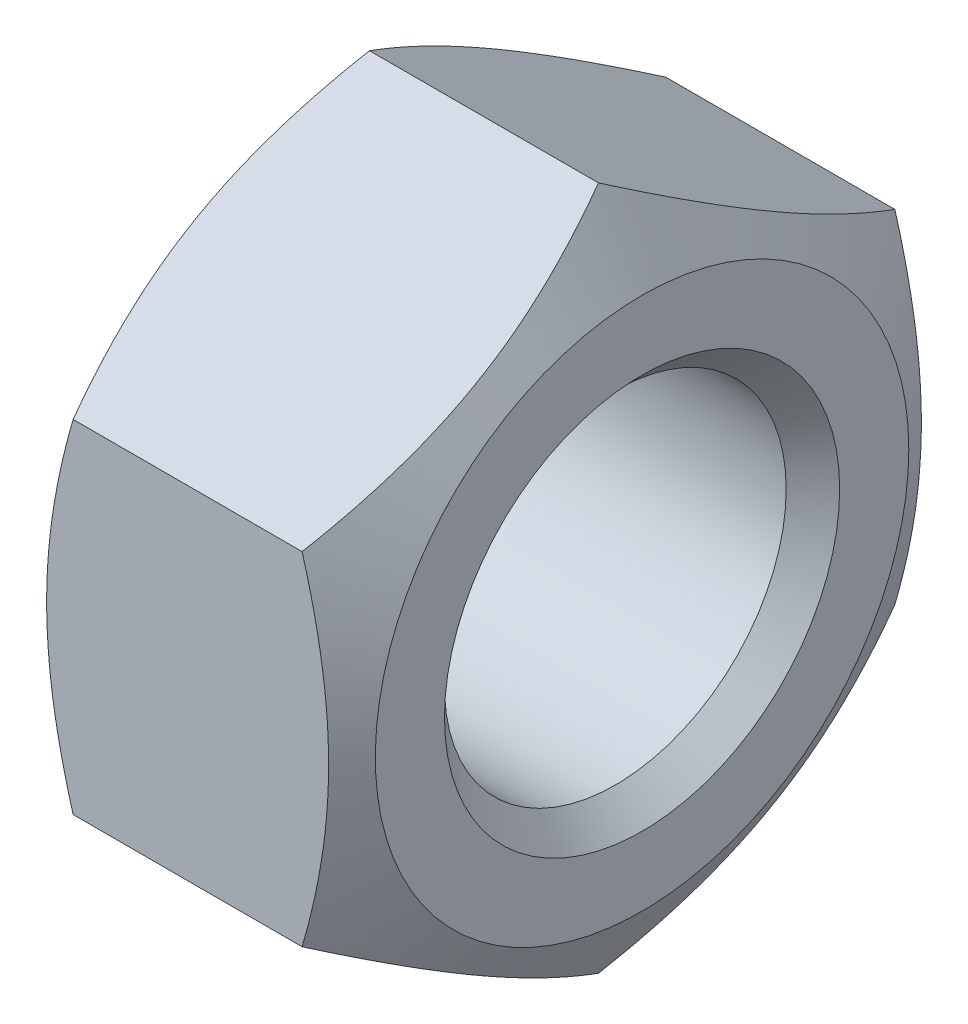
ISO-10303-21;
HEADER;
FILE_DESCRIPTION(('STEP AP214'),'2;1');
FILE_NAME('part.step','',(''),(''),'','','');
FILE_SCHEMA(('AUTOMOTIVE_DESIGN { 1 0 10303 214 1 1 1 1 }'));
ENDSEC;
DATA;
#1=APPLICATION_CONTEXT('core data for automotive mechanical design processes');
#2=APPLICATION_PROTOCOL_DEFINITION('international standard','automotive_design',2000,#1);
#3=PRODUCT_CONTEXT('',#1,'mechanical');
#4=PRODUCT('Part','Part','',(#3));
#5=PRODUCT_RELATED_PRODUCT_CATEGORY('part','',(#4));
#6=PRODUCT_DEFINITION_FORMATION('','',#4);
#7=PRODUCT_DEFINITION_CONTEXT('part definition',#1,'design');
#8=PRODUCT_DEFINITION('design','',#6,#7);
#9=PRODUCT_DEFINITION_SHAPE('','',#8);
#10=(LENGTH_UNIT() NAMED_UNIT(*) SI_UNIT(.MILLI.,.METRE.));
#11=(NAMED_UNIT(*) PLANE_ANGLE_UNIT() SI_UNIT($,.RADIAN.));
#12=(NAMED_UNIT(*) SI_UNIT($,.STERADIAN.) SOLID_ANGLE_UNIT());
#13=UNCERTAINTY_MEASURE_WITH_UNIT(LENGTH_MEASURE(1.E-05),#10,'distance_accuracy_value','');
#14=(GEOMETRIC_REPRESENTATION_CONTEXT(3) GLOBAL_UNCERTAINTY_ASSIGNED_CONTEXT((#13)) GLOBAL_UNIT_ASSIGNED_CONTEXT((#10,
#11,#12)) REPRESENTATION_CONTEXT('',''));
#15=CARTESIAN_POINT('',(0.,0.,0.));
#16=DIRECTION('',(0.,0.,1.));
#17=DIRECTION('',(1.,0.,0.));
#18=AXIS2_PLACEMENT_3D('',#15,#16,#17);
#19=CARTESIAN_POINT('',(17.,-8.66025403784439,15.));
#20=DIRECTION('',(0.,0.866025403784439,-0.5));
#21=DIRECTION('',(-1.,0.,0.));
#22=AXIS2_PLACEMENT_3D('',#19,#20,#21);
#23=PLANE('',#22);
#24=DIRECTION('',(-1.,0.,0.));
#25=VECTOR('',#24,1.);
#26=CARTESIAN_POINT('',(17.,-17.3205080756888,0.));
#27=LINE('',#26,#25);
#28=CARTESIAN_POINT('',(13.79422863406,-17.3205080756888,0.));
#29=VERTEX_POINT('',#28);
#30=CARTESIAN_POINT('',(2.20577136594005,-17.3205080756888,0.));
#31=VERTEX_POINT('',#30);
#32=EDGE_CURVE('E11',#29,#31,#27,.T.);
#33=ORIENTED_EDGE('',*,*,#32,.F.);
#34=CARTESIAN_POINT('',(13.79422863406,-8.6602540378443,14.9999999999999));
#35=CARTESIAN_POINT('',(13.8991261757555,-8.84192359171488,14.6852983750339));
#36=CARTESIAN_POINT('',(13.9995147695393,-9.02420189279882,14.3694011550503));
#37=CARTESIAN_POINT('',(14.1875500503491,-9.38543593226138,13.7433607897277));
#38=CARTESIAN_POINT('',(14.2754561123092,-9.56435807768128,13.4332759667625));
#39=CARTESIAN_POINT('',(14.4385675555884,-9.91987517944504,12.8173894351363));
#40=CARTESIAN_POINT('',(14.5139975727656,-10.0964419783983,12.5116313682666));
#41=CARTESIAN_POINT('',(14.6521419276136,-10.4482799338435,11.9027046336144));
#42=CARTESIAN_POINT('',(14.7150264816919,-10.6235321317174,11.5995637269091));
#43=CARTESIAN_POINT('',(14.8313310937253,-10.9825174262573,10.9776579352064));
#44=CARTESIAN_POINT('',(14.8841975243033,-11.1662770925188,10.6588041275683));
#45=CARTESIAN_POINT('',(14.9746410853243,-11.5312900009397,10.0254562474897));
#46=CARTESIAN_POINT('',(15.0124831807219,-11.7125266536877,9.7109907629071));
#47=CARTESIAN_POINT('',(15.0729487529458,-12.0746196584904,9.08367247843385));
#48=CARTESIAN_POINT('',(15.0956890987236,-12.255467872304,8.77082633692085));
#49=CARTESIAN_POINT('',(15.1261235080341,-12.6183494212901,8.14349468128454));
#50=CARTESIAN_POINT('',(15.1337597892935,-12.8003846449568,7.82900746863451));
#51=CARTESIAN_POINT('',(15.1341799744232,-13.1647935307548,7.19798510778311));
#52=CARTESIAN_POINT('',(15.1268846143356,-13.3471638377922,6.88144796819391));
#53=CARTESIAN_POINT('',(15.0970018982318,-13.7109788717826,6.25026432791454));
#54=CARTESIAN_POINT('',(15.0744763792369,-13.8924243637041,5.93561535275951));
#55=CARTESIAN_POINT('',(15.01429867302,-14.2564875643899,5.30517636923064));
#56=CARTESIAN_POINT('',(14.976530393413,-14.4391034360136,4.98939647053381));
#57=CARTESIAN_POINT('',(14.8861094398957,-14.806857702537,4.35338761379408));
#58=CARTESIAN_POINT('',(14.8331897336047,-14.9919787978695,4.03318692905613));
#59=CARTESIAN_POINT('',(14.716803975678,-15.3522318054601,3.40910116234804));
#60=CARTESIAN_POINT('',(14.6539350189117,-15.5274315108066,3.10514309441268));
#61=CARTESIAN_POINT('',(14.5157143364314,-15.8795664735211,2.49467465582763));
#62=CARTESIAN_POINT('',(14.4401870490862,-16.0564875144641,2.18819593768071));
#63=CARTESIAN_POINT('',(14.2767842003472,-16.4130129248835,1.57086584655567));
#64=CARTESIAN_POINT('',(14.1886781775843,-16.5925932658414,1.26006202100373));
#65=CARTESIAN_POINT('',(14.0001437538872,-16.9552249828855,0.632425493753301));
#66=CARTESIAN_POINT('',(13.8994499743215,-17.1382416695031,0.315652258817438));
#67=CARTESIAN_POINT('',(13.79422863406,-17.3205080756887,0.));
#68=B_SPLINE_CURVE_WITH_KNOTS('',3,(#34,#35,#36,#37,#38,#39,#40,#41,#42,#43,#44,#45,#46,#47,#48,
#49,#50,#51,#52,#53,#54,#55,#56,#57,#58,#59,#60,#61,#62,#63,#64,#65,#66,#67),.UNSPECIFIED.,.F.,
.F.,(4,2,2,2,2,2,2,2,2,2,2,2,2,2,2,2,4),(0.,1.13466083755171,2.24042740435503,3.3233779408359,
4.39045081066898,5.50556903767364,6.60004031109338,7.68593983715371,8.77598561862349,
9.87183286592656,10.9632572959162,12.0631560448031,13.1837781997268,14.2528528343399,
15.3382126822682,16.4468941683269,17.5850584029954),.UNSPECIFIED.);
#69=CARTESIAN_POINT('',(13.7942286340599,-8.66025403784439,15.));
#70=VERTEX_POINT('',#69);
#71=EDGE_CURVE('E378',#70,#29,#68,.T.);
#72=ORIENTED_EDGE('',*,*,#71,.F.);
#73=DIRECTION('',(-1.,0.,0.));
#74=VECTOR('',#73,1.);
#75=CARTESIAN_POINT('',(17.,-8.66025403784439,15.));
#76=LINE('',#75,#74);
#77=CARTESIAN_POINT('',(2.20577136594005,-8.66025403784439,15.));
#78=VERTEX_POINT('',#77);
#79=EDGE_CURVE('E126',#70,#78,#76,.T.);
#80=ORIENTED_EDGE('',*,*,#79,.T.);
#81=CARTESIAN_POINT('',(2.20577136594,-17.3205080756887,0.));
#82=CARTESIAN_POINT('',(2.10087382424535,-17.1388032507926,0.314681261226636));
#83=CARTESIAN_POINT('',(2.00048523046242,-16.9563673838456,0.630487510513418));
#84=CARTESIAN_POINT('',(1.81244994965383,-16.5948175434154,1.25634554805803));
#85=CARTESIAN_POINT('',(1.72454388769406,-16.4157372821103,1.56633908277329));
#86=CARTESIAN_POINT('',(1.56143244441489,-16.0601224507556,2.18216919019412));
#87=CARTESIAN_POINT('',(1.48600242723746,-15.8836115969107,2.48795955698836));
#88=CARTESIAN_POINT('',(1.34785807238815,-15.5321845533786,3.09712353174847));
#89=CARTESIAN_POINT('',(1.28497351830886,-15.3572829261803,3.4004668405309));
#90=CARTESIAN_POINT('',(1.16866890627653,-14.9981893590792,4.02231012102965));
#91=CARTESIAN_POINT('',(1.11580247570014,-14.8139336947084,4.34087756401095));
#92=CARTESIAN_POINT('',(1.02535891468117,-14.4479447953476,4.97366195543826));
#93=CARTESIAN_POINT('',(0.987516819284308,-14.2662280234631,5.28785024310353));
#94=CARTESIAN_POINT('',(0.927051247060506,-13.9040009552543,5.91509112603361));
#95=CARTESIAN_POINT('',(0.90431090128249,-13.7234923561336,6.22813334418601));
#96=CARTESIAN_POINT('',(0.873876491969445,-13.3616479802379,6.85606381200467));
#97=CARTESIAN_POINT('',(0.866240210708108,-13.1803116767426,7.1709545464181));
#98=CARTESIAN_POINT('',(0.86582002557521,-12.816034724781,7.80205307931123));
#99=CARTESIAN_POINT('',(0.873115385660845,-12.6330906741754,8.11825896788828));
#100=CARTESIAN_POINT('',(0.902998101762099,-12.2683771242384,8.7489238497323));
#101=CARTESIAN_POINT('',(0.925523620756717,-12.0866058644418,9.06338474271374));
#102=CARTESIAN_POINT('',(0.985701326973686,-11.7226612895143,9.69389221485569));
#103=CARTESIAN_POINT('',(1.02346960658137,-11.5404958110501,10.0099321481672));
#104=CARTESIAN_POINT('',(1.11389056010084,-11.1735731173405,10.6464211137066));
#105=CARTESIAN_POINT('',(1.1668102663936,-10.9888317377119,10.9668410274175));
#106=CARTESIAN_POINT('',(1.28319602432284,-10.6284841133942,11.5908721671441));
#107=CARTESIAN_POINT('',(1.34606498108973,-10.4528485575494,11.8945785966794));
#108=CARTESIAN_POINT('',(1.48428566357089,-10.1002348628822,12.504770639246));
#109=CARTESIAN_POINT('',(1.55981295091627,-9.92327702771871,12.8112281142407));
#110=CARTESIAN_POINT('',(1.72321579965525,-9.56691619149318,13.428653222321));
#111=CARTESIAN_POINT('',(1.81132182241793,-9.3875423534508,13.739576272386));
#112=CARTESIAN_POINT('',(1.99985624611413,-9.02530903503196,14.3674428151867));
#113=CARTESIAN_POINT('',(2.10055002567909,-8.84248370964822,14.6843265325799));
#114=CARTESIAN_POINT('',(2.20577136594001,-8.66025403784432,15.));
#115=B_SPLINE_CURVE_WITH_KNOTS('',3,(#81,#82,#83,#84,#85,#86,#87,#88,#89,#90,#91,#92,#93,#94,
#95,#96,#97,#98,#99,#100,#101,#102,#103,#104,#105,#106,#107,#108,#109,#110,#111,#112,#113,#114),
.UNSPECIFIED.,.F.,.F.,(4,2,2,2,2,2,2,2,2,2,2,2,2,2,2,2,4),(0.,1.13466083754263,2.24042740434324,
3.3233779408273,4.39045081066893,5.50556903763476,6.60004031104235,7.68593983711598,
8.77598561862312,9.87183286590376,10.963257295885,12.0631560447792,13.1837781997269,
14.2528528343465,15.3382126822773,16.4468941683339,17.5850584029954),.UNSPECIFIED.);
#116=EDGE_CURVE('E229',#31,#78,#115,.T.);
#117=ORIENTED_EDGE('',*,*,#116,.F.);
#118=EDGE_LOOP('',(#33,#72,#80,#117));
#119=FACE_BOUND('',#118,.T.);
#120=ADVANCED_FACE('F17',(#119),#23,.F.);
#121=CARTESIAN_POINT('',(17.,-17.3205080756888,0.));
#122=DIRECTION('',(0.,0.866025403784439,0.5));
#123=DIRECTION('',(1.,0.,0.));
#124=AXIS2_PLACEMENT_3D('',#121,#122,#123);
#125=PLANE('',#124);
#126=DIRECTION('',(-1.,0.,0.));
#127=VECTOR('',#126,1.);
#128=CARTESIAN_POINT('',(17.,-8.66025403784439,-15.));
#129=LINE('',#128,#127);
#130=CARTESIAN_POINT('',(13.7942286340599,-8.66025403784439,-15.));
#131=VERTEX_POINT('',#130);
#132=CARTESIAN_POINT('',(2.20577136594005,-8.66025403784439,-15.));
#133=VERTEX_POINT('',#132);
#134=EDGE_CURVE('E31',#131,#133,#129,.T.);
#135=ORIENTED_EDGE('',*,*,#134,.F.);
#136=CARTESIAN_POINT('',(13.79422863406,-17.3205080756887,0.));
#137=CARTESIAN_POINT('',(13.8991261757522,-17.1388032507969,-0.314681261219434));
#138=CARTESIAN_POINT('',(13.9995147695326,-16.9563673838546,-0.630487510499391));
#139=CARTESIAN_POINT('',(14.1875500503379,-16.5948175434315,-1.25634554803557));
#140=CARTESIAN_POINT('',(14.2754561122967,-16.4157372821286,-1.56633908274925));
#141=CARTESIAN_POINT('',(14.4385675555758,-16.060122450775,-2.1821691901713));
#142=CARTESIAN_POINT('',(14.5139975727539,-15.8836115969291,-2.48795955696838));
#143=CARTESIAN_POINT('',(14.6521419276067,-15.5321845533901,-3.097123531737));
#144=CARTESIAN_POINT('',(14.7150264816887,-15.3572829261861,-3.40046684052516));
#145=CARTESIAN_POINT('',(14.8313310937235,-14.998189359081,-4.02231012102193));
#146=CARTESIAN_POINT('',(14.8841975243002,-14.8139336947121,-4.34087756399548));
#147=CARTESIAN_POINT('',(14.9746410853196,-14.4479447953549,-4.9736619554131));
#148=CARTESIAN_POINT('',(15.0124831807163,-14.2662280234721,-5.28785024307643));
#149=CARTESIAN_POINT('',(15.07294875294,-13.9040009552646,-5.91509112600732));
#150=CARTESIAN_POINT('',(15.0956890987179,-13.7234923561436,-6.22813334416247));
#151=CARTESIAN_POINT('',(15.1261235080309,-13.3616479802445,-6.85606381199092));
#152=CARTESIAN_POINT('',(15.133759789292,-13.1803116767462,-7.17095454641139));
#153=CARTESIAN_POINT('',(15.1341799744246,-12.8160347247786,-7.8020530793159));
#154=CARTESIAN_POINT('',(15.126884614339,-12.63309067417,-8.11825896789729));
#155=CARTESIAN_POINT('',(15.0970018982376,-12.2683771242286,-8.74892384974684));
#156=CARTESIAN_POINT('',(15.074476379243,-12.0866058644306,-9.06338474272947));
#157=CARTESIAN_POINT('',(15.0142986730261,-11.7226612895021,-9.69389221487091));
#158=CARTESIAN_POINT('',(14.9765303934186,-11.5404958110385,-10.0099321481807));
#159=CARTESIAN_POINT('',(14.8861094398991,-11.1735731173331,-10.6464211137145));
#160=CARTESIAN_POINT('',(14.8331897336063,-10.9888317377081,-10.9668410274214));
#161=CARTESIAN_POINT('',(14.7168039756758,-10.628484113393,-11.5908721671486));
#162=CARTESIAN_POINT('',(14.6539350189073,-10.4528485575471,-11.8945785966884));
#163=CARTESIAN_POINT('',(14.5157143364241,-10.1002348628776,-12.5047706392608));
#164=CARTESIAN_POINT('',(14.4401870490784,-9.923277027713,-12.8112281142568));
#165=CARTESIAN_POINT('',(14.2767842003395,-9.56691619148652,-13.428653222337));
#166=CARTESIAN_POINT('',(14.1886781775773,-9.38754235344429,-13.7395762724004));
#167=CARTESIAN_POINT('',(14.000143753883,-9.02530903502761,-14.3674428151952));
#168=CARTESIAN_POINT('',(13.8994499743195,-8.84248370964587,-14.6843265325841));
#169=CARTESIAN_POINT('',(13.79422863406,-8.66025403784432,-15.));
#170=B_SPLINE_CURVE_WITH_KNOTS('',3,(#136,#137,#138,#139,#140,#141,#142,#143,#144,#145,#146,
#147,#148,#149,#150,#151,#152,#153,#154,#155,#156,#157,#158,#159,#160,#161,#162,#163,#164,#165,
#166,#167,#168,#169),.UNSPECIFIED.,.F.,.F.,(4,2,2,2,2,2,2,2,2,2,2,2,2,2,2,2,4),(0.,
1.13466083751655,2.24042740430934,3.32337794080255,4.39045081066873,5.50556903761205,
6.60004031101204,7.68593983709323,8.77598561862322,9.87183286591956,10.9632572959061,
12.0631560447951,13.1837781997272,14.2528528343608,15.3382126822968,16.4468941683489,
17.5850584029956),.UNSPECIFIED.);
#171=EDGE_CURVE('E385',#29,#131,#170,.T.);
#172=ORIENTED_EDGE('',*,*,#171,.F.);
#173=ORIENTED_EDGE('',*,*,#32,.T.);
#174=CARTESIAN_POINT('',(2.20577136593998,-8.66025403784429,-14.9999999999999));
#175=CARTESIAN_POINT('',(2.10087382424533,-8.84192359171345,-14.6852983750364));
#176=CARTESIAN_POINT('',(2.0004852304624,-9.02420189279617,-14.3694011550555));
#177=CARTESIAN_POINT('',(1.81244994965382,-9.3854359322574,-13.7433607897364));
#178=CARTESIAN_POINT('',(1.72454388769405,-9.5643580776772,-13.4332759667722));
#179=CARTESIAN_POINT('',(1.56143244441486,-9.91987517944155,-12.8173894351461));
#180=CARTESIAN_POINT('',(1.48600242723742,-10.0964419783955,-12.5116313682756));
#181=CARTESIAN_POINT('',(1.34785807238815,-10.448279933842,-11.9027046336199));
#182=CARTESIAN_POINT('',(1.28497351830891,-10.6235321317166,-11.5995637269117));
#183=CARTESIAN_POINT('',(1.16866890627567,-10.9825174262527,-10.977657935213));
#184=CARTESIAN_POINT('',(1.11580247569848,-11.1662770925098,-10.6588041275818));
#185=CARTESIAN_POINT('',(1.02535891467851,-11.531290000926,-10.0254562475127));
#186=CARTESIAN_POINT('',(0.987516819281316,-11.7125266536735,-9.71099076293279));
#187=CARTESIAN_POINT('',(0.92705124705746,-12.0746196584778,-9.08367247846019));
#188=CARTESIAN_POINT('',(0.904310901279589,-12.2554678722934,-8.77082633694517));
#189=CARTESIAN_POINT('',(0.87387649196774,-12.6183494212845,-8.14349468129946));
#190=CARTESIAN_POINT('',(0.866240210707338,-12.800384644954,-7.82900746864203));
#191=CARTESIAN_POINT('',(0.865820025575955,-13.1647935307519,-7.19798510778524));
#192=CARTESIAN_POINT('',(0.87311538566253,-13.3471638377862,-6.88144796819805));
#193=CARTESIAN_POINT('',(0.902998101764981,-13.7109788717731,-6.25026432792182));
#194=CARTESIAN_POINT('',(0.925523620759746,-13.892424363694,-5.9356153527679));
#195=CARTESIAN_POINT('',(0.985701326976663,-14.2564875643804,-5.30517636923957));
#196=CARTESIAN_POINT('',(1.02346960658402,-14.4391034360052,-4.98939647054217));
#197=CARTESIAN_POINT('',(1.11389056010248,-14.8068577025322,-4.35338761379931));
#198=CARTESIAN_POINT('',(1.16681026639442,-14.9919787978672,-4.03318692905881));
#199=CARTESIAN_POINT('',(1.28319602432265,-15.3522318054615,-3.40910116234685));
#200=CARTESIAN_POINT('',(1.34606498108945,-15.5274315108091,-3.10514309441019));
#201=CARTESIAN_POINT('',(1.4842856635705,-15.8795664735251,-2.49467465582322));
#202=CARTESIAN_POINT('',(1.55981295091583,-16.0564875144683,-2.18819593767568));
#203=CARTESIAN_POINT('',(1.72321579965481,-16.4130129248875,-1.57086584655039));
#204=CARTESIAN_POINT('',(1.81132182241754,-16.5925932658449,-1.2600620209988));
#205=CARTESIAN_POINT('',(1.99985624611391,-16.9552249828875,-0.632425493750219));
#206=CARTESIAN_POINT('',(2.10055002567899,-17.138241669504,-0.315652258815852));
#207=CARTESIAN_POINT('',(2.20577136594002,-17.3205080756887,0.));
#208=B_SPLINE_CURVE_WITH_KNOTS('',3,(#174,#175,#176,#177,#178,#179,#180,#181,#182,#183,#184,
#185,#186,#187,#188,#189,#190,#191,#192,#193,#194,#195,#196,#197,#198,#199,#200,#201,#202,#203,
#204,#205,#206,#207),.UNSPECIFIED.,.F.,.F.,(4,2,2,2,2,2,2,2,2,2,2,2,2,2,2,2,4),(0.,
1.13466083754263,2.24042740434323,3.32337794082729,4.39045081066891,5.5055690376492,
6.60004031106123,7.68593983712988,8.77598561862333,9.87183286591653,10.9632572959024,
12.0631560447925,13.1837781997269,14.2528528343454,15.3382126822757,16.4468941683326,
17.5850584029954),.UNSPECIFIED.);
#209=EDGE_CURVE('E344',#133,#31,#208,.T.);
#210=ORIENTED_EDGE('',*,*,#209,.F.);
#211=EDGE_LOOP('',(#135,#172,#173,#210));
#212=FACE_BOUND('',#211,.T.);
#213=ADVANCED_FACE('F326',(#212),#125,.F.);
#214=CARTESIAN_POINT('',(17.,-8.66025403784439,-15.));
#215=DIRECTION('',(0.,0.,1.));
#216=DIRECTION('',(1.,0.,0.));
#217=AXIS2_PLACEMENT_3D('',#214,#215,#216);
#218=PLANE('',#217);
#219=DIRECTION('',(-1.,0.,0.));
#220=VECTOR('',#219,1.);
#221=CARTESIAN_POINT('',(17.,8.66025403784439,-15.));
#222=LINE('',#221,#220);
#223=CARTESIAN_POINT('',(13.7942286340599,8.66025403784439,-15.));
#224=VERTEX_POINT('',#223);
#225=CARTESIAN_POINT('',(2.20577136594005,8.66025403784439,-15.));
#226=VERTEX_POINT('',#225);
#227=EDGE_CURVE('E408',#224,#226,#222,.T.);
#228=ORIENTED_EDGE('',*,*,#227,.F.);
#229=CARTESIAN_POINT('',(13.7942286340599,-8.66025403784445,-15.));
#230=CARTESIAN_POINT('',(13.8990749565879,-8.29705723863292,-14.9999792659231));
#231=CARTESIAN_POINT('',(13.9994210891441,-7.93252314088246,-14.999879233704));
#232=CARTESIAN_POINT('',(14.1873693376505,-7.21016087451672,-14.9996743032679));
#233=CARTESIAN_POINT('',(14.2752322197186,-6.85240037945784,-14.9995695955485));
#234=CARTESIAN_POINT('',(14.4382564198891,-6.14181294921891,-14.9994935790259));
#235=CARTESIAN_POINT('',(14.51364401192,-5.78903828135921,-14.9995195394794));
#236=CARTESIAN_POINT('',(14.6516968305076,-5.08643816454222,-14.9997753560983));
#237=CARTESIAN_POINT('',(14.7145342461893,-4.73664663309158,-15.0000021809001));
#238=CARTESIAN_POINT('',(14.8310808911,-4.01736697484692,-14.9999977088141));
#239=CARTESIAN_POINT('',(14.8841678282644,-3.6477773056032,-14.9997426651451));
#240=CARTESIAN_POINT('',(14.9749351485617,-2.91367306841374,-14.9992144230761));
#241=CARTESIAN_POINT('',(15.0128836637199,-2.54919192555624,-14.9989416504573));
#242=CARTESIAN_POINT('',(15.0734391283736,-1.82182063857534,-14.9988647919889));
#243=CARTESIAN_POINT('',(15.096163868904,-1.45894038095972,-14.9990570532608));
#244=CARTESIAN_POINT('',(15.126454146947,-0.731128669521269,-14.9996215568687));
#245=CARTESIAN_POINT('',(15.1339600393729,-0.366194744563475,-14.9999945002846));
#246=CARTESIAN_POINT('',(15.1339891016773,0.363919298509963,-15.000005503416));
#247=CARTESIAN_POINT('',(15.126502186832,0.729099417057911,-14.9996430684864));
#248=CARTESIAN_POINT('',(15.0962316519723,1.45741140682611,-14.9990939559028));
#249=CARTESIAN_POINT('',(15.0735073783763,1.82054573366878,-14.9989066030905));
#250=CARTESIAN_POINT('',(15.0129337470538,2.54843993400738,-14.9989879906263));
#251=CARTESIAN_POINT('',(14.9749658849701,2.91318986481511,-14.9992603593092));
#252=CARTESIAN_POINT('',(14.884144329551,3.6478536184157,-14.9997728945419));
#253=CARTESIAN_POINT('',(14.8310215464966,4.01773390286179,-15.0000123510359));
#254=CARTESIAN_POINT('',(14.7144444610974,4.73720005209656,-14.9999882561141));
#255=CARTESIAN_POINT('',(14.6516264043641,5.08688973393506,-14.9997488528232));
#256=CARTESIAN_POINT('',(14.5136049015609,5.78931624366474,-14.9994833718048));
#257=CARTESIAN_POINT('',(14.4382281898905,6.14201894167638,-14.9994605818574));
#258=CARTESIAN_POINT('',(14.2752211854565,6.85249504983135,-14.9995464781508));
#259=CARTESIAN_POINT('',(14.1873636504165,7.21021596453417,-14.9996579816017));
#260=CARTESIAN_POINT('',(13.9994206795329,7.93253343136093,-14.9998743897287));
#261=CARTESIAN_POINT('',(13.899073594459,8.29706207889922,-14.9999790423754));
#262=CARTESIAN_POINT('',(13.79422863406,8.66025403784437,-15.));
#263=B_SPLINE_CURVE_WITH_KNOTS('',3,(#229,#230,#231,#232,#233,#234,#235,#236,#237,#238,#239,
#240,#241,#242,#243,#244,#245,#246,#247,#248,#249,#250,#251,#252,#253,#254,#255,#256,#257,#258,
#259,#260,#261,#262),.UNSPECIFIED.,.F.,.F.,(4,2,2,2,2,2,2,2,2,2,2,2,2,2,2,2,4),(0.,
1.13410650566249,2.23913779766088,3.32117290716429,4.3871514929319,5.50703551340731,
6.60609502064596,7.69654940189671,8.79126925041549,9.88672569583433,10.9779401536816,
12.077807310537,13.1985691062568,14.2642367022322,15.3460537485288,16.4509659988225,
17.5850575188868),.UNSPECIFIED.);
#264=EDGE_CURVE('E119',#131,#224,#263,.T.);
#265=ORIENTED_EDGE('',*,*,#264,.F.);
#266=ORIENTED_EDGE('',*,*,#134,.T.);
#267=CARTESIAN_POINT('',(2.20577136594004,8.66025403784438,-15.));
#268=CARTESIAN_POINT('',(2.12166454350975,8.36888636809439,-14.9999971921302));
#269=CARTESIAN_POINT('',(2.04045104027611,8.07666738374189,-14.9999263404575));
#270=CARTESIAN_POINT('',(1.8861458726479,7.49674066365605,-14.9997571261881));
#271=CARTESIAN_POINT('',(1.81291828255552,7.20906903527354,-14.9996593802552));
#272=CARTESIAN_POINT('',(1.67457375349724,6.63736606420563,-14.9995370238703));
#273=CARTESIAN_POINT('',(1.60933254671839,6.35336490874688,-14.9995111030802));
#274=CARTESIAN_POINT('',(1.48693893292171,5.78804791637703,-14.9995451332182));
#275=CARTESIAN_POINT('',(1.42968050609525,5.50675510135223,-14.9996038106768));
#276=CARTESIAN_POINT('',(1.32326903607205,4.94579755631261,-14.9998255695121));
#277=CARTESIAN_POINT('',(1.27403482955296,4.66614825032733,-14.9999875118066));
#278=CARTESIAN_POINT('',(1.18076038323472,4.09039523036716,-15.0000131658323));
#279=CARTESIAN_POINT('',(1.13714694575147,3.79422206189446,-14.9998602180445));
#280=CARTESIAN_POINT('',(1.05973742302735,3.20556879867997,-14.9994411482976));
#281=CARTESIAN_POINT('',(1.02579098942889,2.91310857276762,-14.9991769386803));
#282=CARTESIAN_POINT('',(0.967705550181051,2.33012272483348,-14.9988868829695));
#283=CARTESIAN_POINT('',(0.94347311221336,2.03960647363082,-14.9988587114986));
#284=CARTESIAN_POINT('',(0.904744022773536,1.45868116487828,-14.9990549974444));
#285=CARTESIAN_POINT('',(0.890222374807062,1.16827377028175,-14.9992788022294));
#286=CARTESIAN_POINT('',(0.870843260046719,0.585657502519932,-14.9997472161121));
#287=CARTESIAN_POINT('',(0.866034957073744,0.293446936776398,-14.9999919245439));
#288=CARTESIAN_POINT('',(0.866025420668264,0.000840332298309353,-15.0000000116126));
#289=CARTESIAN_POINT('',(0.866025416897764,0.000420166174185607,-15.0000000227358));
#290=CARTESIAN_POINT('',(0.866029690897467,-0.291946924345266,-15.0000074096202));
#291=CARTESIAN_POINT('',(0.870819813871548,-0.583918018466951,-14.999769809445));
#292=CARTESIAN_POINT('',(0.890161392152419,-1.16650454986481,-14.9993146420106));
#293=CARTESIAN_POINT('',(0.904678695284652,-1.45712116027854,-14.9990970076804));
#294=CARTESIAN_POINT('',(0.943410095251881,-2.03846833553373,-14.9989074262855));
#295=CARTESIAN_POINT('',(0.967649324444241,-2.32919722935261,-14.9989361199621));
#296=CARTESIAN_POINT('',(1.02576038556549,-2.91261515385932,-14.9992230018103));
#297=CARTESIAN_POINT('',(1.05972594401068,-3.20529478689982,-14.9994834776637));
#298=CARTESIAN_POINT('',(1.13721369808385,-3.79462619365572,-14.9998858732314));
#299=CARTESIAN_POINT('',(1.18089370116196,-4.09125711673308,-15.0000256236589));
#300=CARTESIAN_POINT('',(1.27420565368761,-4.66716637719937,-14.9999753852628));
#301=CARTESIAN_POINT('',(1.32338946355463,-4.94651765345316,-14.9998027760732));
#302=CARTESIAN_POINT('',(1.42973383236957,-5.50711203432269,-14.9995700394553));
#303=CARTESIAN_POINT('',(1.48698169301613,-5.78833854880014,-14.9995112637634));
#304=CARTESIAN_POINT('',(1.60935711285582,-6.35354309826702,-14.9994810278469));
#305=CARTESIAN_POINT('',(1.67459119804622,-6.63749799961587,-14.9995109081229));
#306=CARTESIAN_POINT('',(1.81292489209443,-7.209129527748,-14.9996425682781));
#307=CARTESIAN_POINT('',(1.88614924852379,-7.4967758491873,-14.9997456884206));
#308=CARTESIAN_POINT('',(2.04045139152241,-8.07667390403043,-14.9999234042759));
#309=CARTESIAN_POINT('',(2.12166553684139,-8.36888941416466,-14.9999973294815));
#310=CARTESIAN_POINT('',(2.20577136594004,-8.66025403784438,-15.));
#311=B_SPLINE_CURVE_WITH_KNOTS('',3,(#267,#268,#269,#270,#271,#272,#273,#274,#275,#276,#277,
#278,#279,#280,#281,#282,#283,#284,#285,#286,#287,#288,#289,#290,#291,#292,#293,#294,#295,#296,
#297,#298,#299,#300,#301,#302,#303,#304,#305,#306,#307,#308,#309,#310),.UNSPECIFIED.,.F.,.F.,(4,
2,2,2,2,2,2,2,2,2,2,2,2,2,2,2,2,2,2,2,2,4),(0.,0.909799921924247,1.80026472626289,
2.67437394156277,3.53546164762388,4.38721150602119,5.2851793253771,6.16830539848395,
7.04272081992254,7.91487665879987,8.79143593947678,8.7926964379496,9.66853717642465,
10.54131883603,11.4163714361538,12.3001577669024,13.1995126703451,14.0503560672375,
14.9112424637892,15.7852116869279,16.6756005634097,17.5853909622599),.UNSPECIFIED.);
#312=EDGE_CURVE('E306',#226,#133,#311,.T.);
#313=ORIENTED_EDGE('',*,*,#312,.F.);
#314=EDGE_LOOP('',(#228,#265,#266,#313));
#315=FACE_BOUND('',#314,.T.);
#316=ADVANCED_FACE('F19',(#315),#218,.F.);
#317=CARTESIAN_POINT('',(17.,8.66025403784439,-15.));
#318=DIRECTION('',(0.,-0.866025403784439,0.5));
#319=DIRECTION('',(-1.,0.,0.));
#320=AXIS2_PLACEMENT_3D('',#317,#318,#319);
#321=PLANE('',#320);
#322=DIRECTION('',(-1.,0.,0.));
#323=VECTOR('',#322,1.);
#324=CARTESIAN_POINT('',(17.,17.3205080756888,0.));
#325=LINE('',#324,#323);
#326=CARTESIAN_POINT('',(13.7942286340599,17.3205080756888,0.));
#327=VERTEX_POINT('',#326);
#328=CARTESIAN_POINT('',(2.20577136594005,17.3205080756888,0.));
#329=VERTEX_POINT('',#328);
#330=EDGE_CURVE('E299',#327,#329,#325,.T.);
#331=ORIENTED_EDGE('',*,*,#330,.F.);
#332=CARTESIAN_POINT('',(13.79422863406,8.66025403784433,-14.9999999999999));
#333=CARTESIAN_POINT('',(13.8991261757539,8.84192359171211,-14.6852983750388));
#334=CARTESIAN_POINT('',(13.999514769536,9.0242018927937,-14.3694011550603));
#335=CARTESIAN_POINT('',(14.1875500503435,9.3854359322537,-13.7433607897446));
#336=CARTESIAN_POINT('',(14.275456112303,9.56435807767342,-13.4332759667813));
#337=CARTESIAN_POINT('',(14.4385675555821,9.91987517943829,-12.8173894351552));
#338=CARTESIAN_POINT('',(14.5139975727598,10.0964419783928,-12.511631368284));
#339=CARTESIAN_POINT('',(14.6521419276101,10.4482799338407,-11.902704633625));
#340=CARTESIAN_POINT('',(14.7150264816902,10.623532131716,-11.5995637269144));
#341=CARTESIAN_POINT('',(14.8313310937252,10.9825174262533,-10.9776579352104));
#342=CARTESIAN_POINT('',(14.8841975243034,11.1662770925107,-10.6588041275763));
#343=CARTESIAN_POINT('',(14.9746410853245,11.531290000927,-10.0254562475035));
#344=CARTESIAN_POINT('',(15.012483180722,11.7125266536744,-9.71099076292267));
#345=CARTESIAN_POINT('',(15.0729487529459,12.0746196584781,-9.08367247844998));
#346=CARTESIAN_POINT('',(15.0956890987236,12.2554678722932,-8.77082633693577));
#347=CARTESIAN_POINT('',(15.1261235080341,12.6183494212842,-8.14349468129382));
#348=CARTESIAN_POINT('',(15.1337597892934,12.8003846449541,-7.82900746863932));
#349=CARTESIAN_POINT('',(15.1341799744233,13.1647935307588,-7.197985107776));
#350=CARTESIAN_POINT('',(15.1268846143357,13.3471638377996,-6.88144796817932));
#351=CARTESIAN_POINT('',(15.0970018982319,13.7109788717939,-6.25026432788954));
#352=CARTESIAN_POINT('',(15.0744763792371,13.8924243637157,-5.93561535273156));
#353=CARTESIAN_POINT('',(15.0142986730203,14.2564875644001,-5.3051763692018));
#354=CARTESIAN_POINT('',(14.9765303934134,14.4391034360219,-4.98939647050702));
#355=CARTESIAN_POINT('',(14.8861094398959,14.8068577025413,-4.35338761377758));
#356=CARTESIAN_POINT('',(14.8331897336046,14.9919787978717,-4.03318692904787));
#357=CARTESIAN_POINT('',(14.7168039756755,15.3522318054659,-3.40910116234225));
#358=CARTESIAN_POINT('',(14.6539350189065,15.5274315108182,-3.10514309440118));
#359=CARTESIAN_POINT('',(14.5157143364227,15.8795664735395,-2.49467465580762));
#360=CARTESIAN_POINT('',(14.4401870490769,16.0564875144835,-2.18819593765785));
#361=CARTESIAN_POINT('',(14.276784200338,16.4130129249018,-1.57086584653158));
#362=CARTESIAN_POINT('',(14.188678177576,16.5925932658574,-1.26006202098122));
#363=CARTESIAN_POINT('',(14.0001437538822,16.9552249828946,-0.632425493739228));
#364=CARTESIAN_POINT('',(13.8994499743191,17.1382416695073,-0.315652258810199));
#365=CARTESIAN_POINT('',(13.79422863406,17.3205080756887,0.));
#366=B_SPLINE_CURVE_WITH_KNOTS('',3,(#332,#333,#334,#335,#336,#337,#338,#339,#340,#341,#342,
#343,#344,#345,#346,#347,#348,#349,#350,#351,#352,#353,#354,#355,#356,#357,#358,#359,#360,#361,
#362,#363,#364,#365),.UNSPECIFIED.,.F.,.F.,(4,2,2,2,2,2,2,2,2,2,2,2,2,2,2,2,4),(0.,
1.13466083753412,2.24042740433219,3.32337794081923,4.39045081066885,5.5055690376572,
6.60004031107146,7.68593983713726,8.77598561862349,9.87183286595114,10.9632572959489,
12.0631560448278,13.1837781997271,14.2528528343648,15.3382126823023,16.4468941683531,
17.5850584029955),.UNSPECIFIED.);
#367=EDGE_CURVE('E111',#224,#327,#366,.T.);
#368=ORIENTED_EDGE('',*,*,#367,.F.);
#369=ORIENTED_EDGE('',*,*,#227,.T.);
#370=CARTESIAN_POINT('',(2.20577136594,17.3205080756887,0.));
#371=CARTESIAN_POINT('',(2.10087382424535,17.1388032507926,-0.314681261226579));
#372=CARTESIAN_POINT('',(2.00048523046242,16.9563673838456,-0.630487510513362));
#373=CARTESIAN_POINT('',(1.81244994965383,16.5948175434154,-1.25634554805798));
#374=CARTESIAN_POINT('',(1.72454388769406,16.4157372821103,-1.56633908277324));
#375=CARTESIAN_POINT('',(1.56143244441488,16.0601224507556,-2.18216919019408));
#376=CARTESIAN_POINT('',(1.48600242723746,15.8836115969107,-2.48795955698833));
#377=CARTESIAN_POINT('',(1.34785807238815,15.5321845533786,-3.09712353174846));
#378=CARTESIAN_POINT('',(1.28497351830886,15.3572829261803,-3.4004668405309));
#379=CARTESIAN_POINT('',(1.16866890627653,14.9981893590792,-4.02231012102966));
#380=CARTESIAN_POINT('',(1.11580247570014,14.8139336947084,-4.34087756401097));
#381=CARTESIAN_POINT('',(1.02535891468117,14.4479447953476,-4.97366195543829));
#382=CARTESIAN_POINT('',(0.987516819284303,14.2662280234631,-5.28785024310357));
#383=CARTESIAN_POINT('',(0.9270512470605,13.9040009552543,-5.91509112603365));
#384=CARTESIAN_POINT('',(0.904310901282485,13.7234923561335,-6.22813334418605));
#385=CARTESIAN_POINT('',(0.873876491969442,13.3616479802378,-6.8560638120047));
#386=CARTESIAN_POINT('',(0.866240210708106,13.1803116767425,-7.17095454641813));
#387=CARTESIAN_POINT('',(0.865820025575211,12.816034724781,-7.80205307931126));
#388=CARTESIAN_POINT('',(0.873115385660848,12.6330906741753,-8.11825896788831));
#389=CARTESIAN_POINT('',(0.902998101762105,12.2683771242384,-8.74892384973234));
#390=CARTESIAN_POINT('',(0.925523620756723,12.0866058644418,-9.06338474271378));
#391=CARTESIAN_POINT('',(0.985701326973692,11.7226612895142,-9.69389221485573));
#392=CARTESIAN_POINT('',(1.02346960658137,11.5404958110501,-10.0099321481672));
#393=CARTESIAN_POINT('',(1.11389056010084,11.1735731173405,-10.6464211137066));
#394=CARTESIAN_POINT('',(1.1668102663936,10.9888317377119,-10.9668410274175));
#395=CARTESIAN_POINT('',(1.28319602432284,10.6284841133942,-11.5908721671441));
#396=CARTESIAN_POINT('',(1.34606498108972,10.4528485575494,-11.8945785966794));
#397=CARTESIAN_POINT('',(1.48428566357089,10.1002348628822,-12.504770639246));
#398=CARTESIAN_POINT('',(1.55981295091627,9.92327702771872,-12.8112281142407));
#399=CARTESIAN_POINT('',(1.72321579965524,9.5669161914932,-13.428653222321));
#400=CARTESIAN_POINT('',(1.81132182241792,9.38754235345082,-13.739576272386));
#401=CARTESIAN_POINT('',(1.99985624611413,9.02530903503199,-14.3674428151867));
#402=CARTESIAN_POINT('',(2.10055002567908,8.84248370964825,-14.6843265325799));
#403=CARTESIAN_POINT('',(2.20577136594001,8.66025403784435,-14.9999999999999));
#404=B_SPLINE_CURVE_WITH_KNOTS('',3,(#370,#371,#372,#373,#374,#375,#376,#377,#378,#379,#380,
#381,#382,#383,#384,#385,#386,#387,#388,#389,#390,#391,#392,#393,#394,#395,#396,#397,#398,#399,
#400,#401,#402,#403),.UNSPECIFIED.,.F.,.F.,(4,2,2,2,2,2,2,2,2,2,2,2,2,2,2,2,4),(0.,
1.13466083754264,2.24042740434324,3.32337794082733,4.39045081066898,5.50556903763485,
6.60004031104245,7.68593983711607,8.7759856186232,9.87183286590385,10.9632572958851,
12.0631560447793,13.183778199727,14.2528528343466,15.3382126822773,16.4468941683339,
17.5850584029955),.UNSPECIFIED.);
#405=EDGE_CURVE('E279',#329,#226,#404,.T.);
#406=ORIENTED_EDGE('',*,*,#405,.F.);
#407=EDGE_LOOP('',(#331,#368,#369,#406));
#408=FACE_BOUND('',#407,.T.);
#409=ADVANCED_FACE('F152',(#408),#321,.F.);
#410=CARTESIAN_POINT('',(17.,17.3205080756888,0.));
#411=DIRECTION('',(0.,-0.866025403784439,-0.5));
#412=DIRECTION('',(0.,0.5,-0.866025403784439));
#413=AXIS2_PLACEMENT_3D('',#410,#411,#412);
#414=PLANE('',#413);
#415=DIRECTION('',(-1.,0.,0.));
#416=VECTOR('',#415,1.);
#417=CARTESIAN_POINT('',(17.,8.66025403784439,15.));
#418=LINE('',#417,#416);
#419=CARTESIAN_POINT('',(13.7942286340599,8.66025403784439,15.));
#420=VERTEX_POINT('',#419);
#421=CARTESIAN_POINT('',(2.20577136594005,8.66025403784439,15.));
#422=VERTEX_POINT('',#421);
#423=EDGE_CURVE('E197',#420,#422,#418,.T.);
#424=ORIENTED_EDGE('',*,*,#423,.F.);
#425=CARTESIAN_POINT('',(13.79422863406,17.3205080756887,0.));
#426=CARTESIAN_POINT('',(13.8991261757531,17.1388032507954,0.314681261221795));
#427=CARTESIAN_POINT('',(13.9995147695343,16.9563673838516,0.630487510504052));
#428=CARTESIAN_POINT('',(14.1875500503407,16.5948175434261,1.25634554804308));
#429=CARTESIAN_POINT('',(14.2754561122998,16.4157372821224,1.56633908275731));
#430=CARTESIAN_POINT('',(14.438567555579,16.0601224507685,2.18216919017896));
#431=CARTESIAN_POINT('',(14.5139975727568,15.8836115969229,2.48795955697509));
#432=CARTESIAN_POINT('',(14.6521419276084,15.5321845533862,3.09712353174086));
#433=CARTESIAN_POINT('',(14.7150264816895,15.3572829261841,3.40046684052709));
#434=CARTESIAN_POINT('',(14.8313310937235,14.9981893590803,4.02231012102468));
#435=CARTESIAN_POINT('',(14.8841975243002,14.8139336947107,4.34087756400098));
#436=CARTESIAN_POINT('',(14.9746410853194,14.4479447953521,4.97366195542204));
#437=CARTESIAN_POINT('',(15.0124831807162,14.2662280234687,5.28785024308606));
#438=CARTESIAN_POINT('',(15.07294875294,13.9040009552607,5.91509112601665));
#439=CARTESIAN_POINT('',(15.0956890987179,13.7234923561398,6.22813334417081));
#440=CARTESIAN_POINT('',(15.1261235080308,13.3616479802421,6.85606381199583));
#441=CARTESIAN_POINT('',(15.1337597892919,13.1803116767449,7.17095454641386));
#442=CARTESIAN_POINT('',(15.1341799744247,12.8160347247771,7.80205307931819));
#443=CARTESIAN_POINT('',(15.1268846143391,12.633090674167,8.11825896790185));
#444=CARTESIAN_POINT('',(15.0970018982377,12.2683771242233,8.74892384975424));
#445=CARTESIAN_POINT('',(15.0744763792431,12.0866058644244,9.06338474273745));
#446=CARTESIAN_POINT('',(15.0142986730262,11.7226612894955,9.69389221487859));
#447=CARTESIAN_POINT('',(14.9765303934188,11.5404958110321,10.0099321481875));
#448=CARTESIAN_POINT('',(14.8861094398992,11.1735731173291,10.6464211137184));
#449=CARTESIAN_POINT('',(14.8331897336062,10.9888317377061,10.9668410274234));
#450=CARTESIAN_POINT('',(14.7168039756749,10.6284841133923,11.5908721671513));
#451=CARTESIAN_POINT('',(14.6539350189056,10.4528485575457,11.8945785966936));
#452=CARTESIAN_POINT('',(14.5157143364212,10.1002348628749,12.5047706392695));
#453=CARTESIAN_POINT('',(14.4401870490753,9.92327702770965,12.8112281142663));
#454=CARTESIAN_POINT('',(14.2767842003364,9.56691619148263,13.4286532223462));
#455=CARTESIAN_POINT('',(14.1886781775746,9.38754235344049,13.7395762724088));
#456=CARTESIAN_POINT('',(14.0001437538814,9.02530903502508,14.3674428152002));
#457=CARTESIAN_POINT('',(13.8994499743187,8.84248370964452,14.6843265325865));
#458=CARTESIAN_POINT('',(13.79422863406,8.66025403784436,14.9999999999999));
#459=B_SPLINE_CURVE_WITH_KNOTS('',3,(#425,#426,#427,#428,#429,#430,#431,#432,#433,#434,#435,
#436,#437,#438,#439,#440,#441,#442,#443,#444,#445,#446,#447,#448,#449,#450,#451,#452,#453,#454,
#455,#456,#457,#458),.UNSPECIFIED.,.F.,.F.,(4,2,2,2,2,2,2,2,2,2,2,2,2,2,2,2,4),(0.,
1.13466083752533,2.24042740432077,3.32337794081092,4.39045081066885,5.50556903762027,
6.60004031102299,7.68593983710146,8.77598561862328,9.87183286592775,10.963257295917,
12.0631560448033,13.1837781997273,14.2528528343691,15.3382126823082,16.4468941683577,
17.5850584029956),.UNSPECIFIED.);
#460=EDGE_CURVE('E363',#327,#420,#459,.T.);
#461=ORIENTED_EDGE('',*,*,#460,.F.);
#462=ORIENTED_EDGE('',*,*,#330,.T.);
#463=CARTESIAN_POINT('',(2.20577136593998,8.66025403784432,14.9999999999999));
#464=CARTESIAN_POINT('',(2.1008738242437,8.84192359171625,14.6852983750315));
#465=CARTESIAN_POINT('',(2.00048523045904,9.02420189280134,14.3694011550454));
#466=CARTESIAN_POINT('',(1.81244994964823,9.38543593226512,13.7433607897195));
#467=CARTESIAN_POINT('',(1.72454388768786,9.56435807768511,13.4332759667535));
#468=CARTESIAN_POINT('',(1.5614324444086,9.91987517944834,12.817389435127));
#469=CARTESIAN_POINT('',(1.48600242723158,10.096441978401,12.5116313682582));
#470=CARTESIAN_POINT('',(1.34785807238467,10.4482799338448,11.9027046336092));
#471=CARTESIAN_POINT('',(1.28497351830725,10.623532131718,11.5995637269064));
#472=CARTESIAN_POINT('',(1.16866890627562,10.9825174262568,10.977657935209));
#473=CARTESIAN_POINT('',(1.11580247569861,11.166277092518,10.6588041275738));
#474=CARTESIAN_POINT('',(1.02535891467881,11.5312900009387,10.0254562474989));
#475=CARTESIAN_POINT('',(0.987516819281491,11.7125266536869,9.71099076291726));
#476=CARTESIAN_POINT('',(0.927051247057586,12.0746196584901,9.08367247844411));
#477=CARTESIAN_POINT('',(0.904310901279647,12.2554678723041,8.77082633693028));
#478=CARTESIAN_POINT('',(0.873876491967834,12.6183494212904,8.14349468129027));
#479=CARTESIAN_POINT('',(0.866240210707383,12.8003846449568,7.82900746863735));
#480=CARTESIAN_POINT('',(0.865820025575908,13.1647935307504,7.19798510778759));
#481=CARTESIAN_POINT('',(0.873115385662555,13.3471638377837,6.88144796820292));
#482=CARTESIAN_POINT('',(0.902998101765022,13.7109788717694,6.25026432793019));
#483=CARTESIAN_POINT('',(0.925523620759808,13.8924243636901,5.93561535277724));
#484=CARTESIAN_POINT('',(0.98570132697674,14.256487564377,5.30517636924919));
#485=CARTESIAN_POINT('',(1.02346960658417,14.4391034360024,4.9893964705511));
#486=CARTESIAN_POINT('',(1.11389056010254,14.8068577025307,4.3533876138048));
#487=CARTESIAN_POINT('',(1.16681026639439,14.9919787978665,4.03318692906153));
#488=CARTESIAN_POINT('',(1.28319602432182,15.3522318054595,3.40910116234874));
#489=CARTESIAN_POINT('',(1.34606498108773,15.5274315108053,3.10514309441398));
#490=CARTESIAN_POINT('',(1.4842856635676,15.879566473519,2.49467465582984));
#491=CARTESIAN_POINT('',(1.55981295091273,16.0564875144618,2.18819593768326));
#492=CARTESIAN_POINT('',(1.72321579965174,16.4130129248814,1.57086584655838));
#493=CARTESIAN_POINT('',(1.81132182241477,16.5925932658395,1.26006202100626));
#494=CARTESIAN_POINT('',(1.99985624611225,16.9552249828845,0.632425493754864));
#495=CARTESIAN_POINT('',(2.10055002567818,17.1382416695026,0.315652258818222));
#496=CARTESIAN_POINT('',(2.20577136594002,17.3205080756887,0.));
#497=B_SPLINE_CURVE_WITH_KNOTS('',3,(#463,#464,#465,#466,#467,#468,#469,#470,#471,#472,#473,
#474,#475,#476,#477,#478,#479,#480,#481,#482,#483,#484,#485,#486,#487,#488,#489,#490,#491,#492,
#493,#494,#495,#496),.UNSPECIFIED.,.F.,.F.,(4,2,2,2,2,2,2,2,2,2,2,2,2,2,2,2,4),(0.,
1.13466083756021,2.24042740436607,3.32337794084395,4.39045081066904,5.50556903766558,
6.60004031108305,7.68593983714622,8.77598561862322,9.87183286590824,10.9632572958914,
12.0631560447842,13.1837781997267,14.252852834337,15.3382126822643,16.4468941683239,
17.5850584029954),.UNSPECIFIED.);
#498=EDGE_CURVE('E290',#422,#329,#497,.T.);
#499=ORIENTED_EDGE('',*,*,#498,.F.);
#500=EDGE_LOOP('',(#424,#461,#462,#499));
#501=FACE_BOUND('',#500,.T.);
#502=ADVANCED_FACE('F208',(#501),#414,.F.);
#503=CARTESIAN_POINT('',(17.,8.66025403784439,15.));
#504=DIRECTION('',(0.,0.,-1.));
#505=DIRECTION('',(0.,-1.,0.));
#506=AXIS2_PLACEMENT_3D('',#503,#504,#505);
#507=PLANE('',#506);
#508=ORIENTED_EDGE('',*,*,#79,.F.);
#509=CARTESIAN_POINT('',(13.7942286340599,8.6602540378444,15.));
#510=CARTESIAN_POINT('',(13.8783354564914,8.36888636809034,14.9999971921302));
#511=CARTESIAN_POINT('',(13.9595489597263,8.07666738373379,14.9999263404573));
#512=CARTESIAN_POINT('',(14.1138541273563,7.496740663642,14.999757126187));
#513=CARTESIAN_POINT('',(14.1870817174493,7.2090690352576,14.9996593802536));
#514=CARTESIAN_POINT('',(14.3254262465082,6.63736606418793,14.9995370238679));
#515=CARTESIAN_POINT('',(14.3906674532871,6.35336490872932,14.9995111030774));
#516=CARTESIAN_POINT('',(14.5130610670832,5.78804791636164,14.999545133215));
#517=CARTESIAN_POINT('',(14.5703194939091,5.50675510133889,14.9996038106737));
#518=CARTESIAN_POINT('',(14.6767309639305,4.94579755630507,14.99982556951));
#519=CARTESIAN_POINT('',(14.7259651704483,4.66614825032356,14.9999875118055));
#520=CARTESIAN_POINT('',(14.8192396167644,4.09039523036869,15.0000131658335));
#521=CARTESIAN_POINT('',(14.8628530542466,3.79422206189751,14.9998602180472));
#522=CARTESIAN_POINT('',(14.9402625769693,3.20556879868517,14.9994411483024));
#523=CARTESIAN_POINT('',(14.9742090105673,2.91310857277347,14.9991769386859));
#524=CARTESIAN_POINT('',(15.0322944498147,2.33012272483984,14.998886882976));
#525=CARTESIAN_POINT('',(15.0565268877824,2.03960647363704,14.9988587115051));
#526=CARTESIAN_POINT('',(15.0952559772226,1.45868116488362,14.9990549974506));
#527=CARTESIAN_POINT('',(15.1097776251894,1.16827377028632,14.9992788022351));
#528=CARTESIAN_POINT('',(15.1291567399514,0.585657502522479,14.9997472161153));
#529=CARTESIAN_POINT('',(15.1339650429258,0.293446936777683,14.9999919245451));
#530=CARTESIAN_POINT('',(15.1339745793317,0.000840332298311667,15.0000000116126));
#531=CARTESIAN_POINT('',(15.1339745831022,0.000420166174186764,15.0000000227358));
#532=CARTESIAN_POINT('',(15.133970309103,-0.291946924342834,15.000007409619));
#533=CARTESIAN_POINT('',(15.1291801861287,-0.583918018462087,14.9997698094446));
#534=CARTESIAN_POINT('',(15.1098386078478,-1.16650454985628,14.999314642011));
#535=CARTESIAN_POINT('',(15.0953213047157,-1.45712116026878,14.9990970076808));
#536=CARTESIAN_POINT('',(15.0565899047485,-2.03846833552273,14.9989074262863));
#537=CARTESIAN_POINT('',(15.0323506755561,-2.32919722934158,14.9989361199631));
#538=CARTESIAN_POINT('',(14.9742396144348,-2.9126151538495,14.9992230018117));
#539=CARTESIAN_POINT('',(14.9402740559896,-3.2052947868912,14.9994834776652));
#540=CARTESIAN_POINT('',(14.8627863019163,-3.79462619365079,14.9998858732325));
#541=CARTESIAN_POINT('',(14.8191062988381,-4.09125711673062,15.0000256236595));
#542=CARTESIAN_POINT('',(14.725794346313,-4.66716637719755,14.9999753852623));
#543=CARTESIAN_POINT('',(14.6766105364466,-4.94651765344952,14.9998027760722));
#544=CARTESIAN_POINT('',(14.5702661676325,-5.50711203431626,14.9995700394538));
#545=CARTESIAN_POINT('',(14.5130183069862,-5.78833854879272,14.9995112637619));
#546=CARTESIAN_POINT('',(14.3906428871468,-6.35354309825856,14.9994810278455));
#547=CARTESIAN_POINT('',(14.3254088019564,-6.63749799960733,14.9995109081218));
#548=CARTESIAN_POINT('',(14.1870751079079,-7.20912952774031,14.9996425682773));
#549=CARTESIAN_POINT('',(14.1138507514782,-7.49677584918052,14.9997456884201));
#550=CARTESIAN_POINT('',(13.9595486084788,-8.07667390402652,14.9999234042758));
#551=CARTESIAN_POINT('',(13.8783344631592,-8.36888941416271,14.9999973294815));
#552=CARTESIAN_POINT('',(13.79422863406,-8.66025403784438,15.));
#553=B_SPLINE_CURVE_WITH_KNOTS('',3,(#509,#510,#511,#512,#513,#514,#515,#516,#517,#518,#519,
#520,#521,#522,#523,#524,#525,#526,#527,#528,#529,#530,#531,#532,#533,#534,#535,#536,#537,#538,
#539,#540,#541,#542,#543,#544,#545,#546,#547,#548,#549,#550,#551,#552),.UNSPECIFIED.,.F.,.F.,(4,
2,2,2,2,2,2,2,2,2,2,2,2,2,2,2,2,2,2,2,2,4),(0.,0.909799921936935,1.80026472628154,
2.67437394158103,3.5354616476358,4.3872115060213,5.28517932537228,6.16830539847708,
7.04272081991607,7.91487665879576,8.79143593947652,8.79269643794934,9.66853717641709,
10.5413188360188,11.4163714361425,12.3001577668948,13.1995126703448,14.0503560672315,
14.9112424637802,15.7852116869187,16.6756005634033,17.5853909622596),.UNSPECIFIED.);
#554=EDGE_CURVE('E192',#420,#70,#553,.T.);
#555=ORIENTED_EDGE('',*,*,#554,.F.);
#556=ORIENTED_EDGE('',*,*,#423,.T.);
#557=CARTESIAN_POINT('',(2.20577136594004,-8.66025403784443,15.));
#558=CARTESIAN_POINT('',(2.10092504341371,-8.29705723863849,14.9999792659231));
#559=CARTESIAN_POINT('',(2.00057891085921,-7.9325231408936,14.9998792337045));
#560=CARTESIAN_POINT('',(1.81263066235504,-7.21016087453511,14.9996743032697));
#561=CARTESIAN_POINT('',(1.72476778028753,-6.85240037947787,14.999569595551));
#562=CARTESIAN_POINT('',(1.56174358011712,-6.14181294923863,14.9994935790295));
#563=CARTESIAN_POINT('',(1.48635598808576,-5.78903828137693,14.9995195394833));
#564=CARTESIAN_POINT('',(1.34830316949586,-5.08643816455273,14.9997753561012));
#565=CARTESIAN_POINT('',(1.28546575381243,-4.73664663309685,15.0000021809017));
#566=CARTESIAN_POINT('',(1.16891910889895,-4.01736697484601,14.9999977088123));
#567=CARTESIAN_POINT('',(1.11583217173326,-3.64777730560139,14.9997426651414));
#568=CARTESIAN_POINT('',(1.02506485143442,-2.91367306841088,14.9992144230698));
#569=CARTESIAN_POINT('',(0.987116336275956,-2.54919192555323,14.9989416504504));
#570=CARTESIAN_POINT('',(0.926560871622188,-1.82182063857256,14.9988647919818));
#571=CARTESIAN_POINT('',(0.903836131092055,-1.45894038095733,14.999057053254));
#572=CARTESIAN_POINT('',(0.873545853050637,-0.731128669519921,14.9996215568647));
#573=CARTESIAN_POINT('',(0.866039960626082,-0.366194744562787,14.9999945002829));
#574=CARTESIAN_POINT('',(0.866010898323708,0.363919298524111,15.0000055034177));
#575=CARTESIAN_POINT('',(0.873497813170125,0.729099417086177,14.9996430684891));
#576=CARTESIAN_POINT('',(0.903768348031486,1.45741140687337,14.999093955905));
#577=CARTESIAN_POINT('',(0.92649262162757,1.82054573372093,14.9989066030911));
#578=CARTESIAN_POINT('',(0.987066252950015,2.54843993405979,14.9989879906239));
#579=CARTESIAN_POINT('',(1.02503411503302,2.91318986486294,14.9992603593053));
#580=CARTESIAN_POINT('',(1.11585567045106,3.6478536184445,14.9997728945382));
#581=CARTESIAN_POINT('',(1.16897845350461,4.01773390287617,15.0000123510338));
#582=CARTESIAN_POINT('',(1.28555553890496,4.73720005210427,14.999988256116));
#583=CARTESIAN_POINT('',(1.34837359564095,5.08688973395038,14.9997488528273));
#584=CARTESIAN_POINT('',(1.48639509844755,5.78931624369054,14.9994833718106));
#585=CARTESIAN_POINT('',(1.56177181011853,6.14201894170509,14.9994605818627));
#586=CARTESIAN_POINT('',(1.72477881455245,6.85249504986054,14.9995464781545));
#587=CARTESIAN_POINT('',(1.81263634959156,7.21021596456096,14.9996579816043));
#588=CARTESIAN_POINT('',(2.00057932047196,7.93253343137717,14.9998743897295));
#589=CARTESIAN_POINT('',(2.10092640554342,8.29706207890736,14.9999790423755));
#590=CARTESIAN_POINT('',(2.20577136594004,8.66025403784438,15.));
#591=B_SPLINE_CURVE_WITH_KNOTS('',3,(#557,#558,#559,#560,#561,#562,#563,#564,#565,#566,#567,
#568,#569,#570,#571,#572,#573,#574,#575,#576,#577,#578,#579,#580,#581,#582,#583,#584,#585,#586,
#587,#588,#589,#590),.UNSPECIFIED.,.F.,.F.,(4,2,2,2,2,2,2,2,2,2,2,2,2,2,2,2,4),(0.,
1.13410650564502,2.23913779763817,3.32117290714772,4.38715149293176,5.50703551341037,
6.60609502064954,7.69654940189904,8.79126925041574,9.88672569587702,10.977940153739,
12.0778073105804,13.1985691062571,14.2642367022564,15.3460537485619,16.4509659988481,
17.5850575188869),.UNSPECIFIED.);
#592=EDGE_CURVE('E350',#78,#422,#591,.T.);
#593=ORIENTED_EDGE('',*,*,#592,.F.);
#594=EDGE_LOOP('',(#508,#555,#556,#593));
#595=FACE_BOUND('',#594,.T.);
#596=ADVANCED_FACE('F199',(#595),#507,.F.);
#597=CARTESIAN_POINT('',(14.647,0.,0.));
#598=DIRECTION('',(1.,0.,0.));
#599=DIRECTION('',(0.,0.,-1.));
#600=AXIS2_PLACEMENT_3D('',#597,#598,#599);
#601=CONICAL_SURFACE('',#600,8.647,0.785398163397448);
#602=CARTESIAN_POINT('',(14.647,0.,0.));
#603=DIRECTION('',(1.,0.,0.));
#604=DIRECTION('',(0.,0.,-1.));
#605=AXIS2_PLACEMENT_3D('',#602,#603,#604);
#606=CIRCLE('',#605,8.647);
#607=CARTESIAN_POINT('',(14.647,0.,-8.647));
#608=VERTEX_POINT('',#607);
#609=EDGE_CURVE('E42',#608,#608,#606,.T.);
#610=ORIENTED_EDGE('',*,*,#609,.F.);
#611=EDGE_LOOP('',(#610));
#612=FACE_BOUND('',#611,.T.);
#613=CARTESIAN_POINT('',(16.,0.,0.));
#614=DIRECTION('',(1.,0.,0.));
#615=DIRECTION('',(0.,0.,-1.));
#616=AXIS2_PLACEMENT_3D('',#613,#614,#615);
#617=CIRCLE('',#616,10.);
#618=CARTESIAN_POINT('',(16.,0.,-10.));
#619=VERTEX_POINT('',#618);
#620=EDGE_CURVE('E106',#619,#619,#617,.T.);
#621=ORIENTED_EDGE('',*,*,#620,.T.);
#622=EDGE_LOOP('',(#621));
#623=FACE_BOUND('',#622,.T.);
#624=ADVANCED_FACE('F107',(#612,#623),#601,.F.);
#625=CARTESIAN_POINT('',(16.,0.,0.));
#626=DIRECTION('',(1.,0.,0.));
#627=DIRECTION('',(0.,0.,-1.));
#628=AXIS2_PLACEMENT_3D('',#625,#626,#627);
#629=CYLINDRICAL_SURFACE('',#628,8.647);
#630=CARTESIAN_POINT('',(1.353,0.,0.));
#631=DIRECTION('',(1.,0.,0.));
#632=DIRECTION('',(0.,0.,-1.));
#633=AXIS2_PLACEMENT_3D('',#630,#631,#632);
#634=CIRCLE('',#633,8.647);
#635=CARTESIAN_POINT('',(1.353,0.,-8.647));
#636=VERTEX_POINT('',#635);
#637=EDGE_CURVE('E110',#636,#636,#634,.T.);
#638=ORIENTED_EDGE('',*,*,#637,.F.);
#639=EDGE_LOOP('',(#638));
#640=FACE_BOUND('',#639,.T.);
#641=ORIENTED_EDGE('',*,*,#609,.T.);
#642=EDGE_LOOP('',(#641));
#643=FACE_BOUND('',#642,.T.);
#644=ADVANCED_FACE('F435',(#640,#643),#629,.F.);
#645=CARTESIAN_POINT('',(0.,0.,0.));
#646=DIRECTION('',(-1.,0.,0.));
#647=DIRECTION('',(0.,0.,1.));
#648=AXIS2_PLACEMENT_3D('',#645,#646,#647);
#649=CONICAL_SURFACE('',#648,10.,0.785398163397448);
#650=CARTESIAN_POINT('',(0.,0.,0.));
#651=DIRECTION('',(1.,0.,0.));
#652=DIRECTION('',(0.,0.,-1.));
#653=AXIS2_PLACEMENT_3D('',#650,#651,#652);
#654=CIRCLE('',#653,10.);
#655=CARTESIAN_POINT('',(0.,0.,-10.));
#656=VERTEX_POINT('',#655);
#657=EDGE_CURVE('E302',#656,#656,#654,.T.);
#658=ORIENTED_EDGE('',*,*,#657,.F.);
#659=EDGE_LOOP('',(#658));
#660=FACE_BOUND('',#659,.T.);
#661=ORIENTED_EDGE('',*,*,#637,.T.);
#662=EDGE_LOOP('',(#661));
#663=FACE_BOUND('',#662,.T.);
#664=ADVANCED_FACE('F150',(#660,#663),#649,.F.);
#665=CARTESIAN_POINT('',(16.,13.5,0.));
#666=DIRECTION('',(-1.,0.,0.));
#667=DIRECTION('',(0.,0.,1.));
#668=AXIS2_PLACEMENT_3D('',#665,#666,#667);
#669=PLANE('',#668);
#670=CARTESIAN_POINT('',(16.,0.,0.));
#671=DIRECTION('',(1.,0.,0.));
#672=DIRECTION('',(0.,0.,-1.));
#673=AXIS2_PLACEMENT_3D('',#670,#671,#672);
#674=CIRCLE('',#673,13.5);
#675=CARTESIAN_POINT('',(16.,0.,-13.5));
#676=VERTEX_POINT('',#675);
#677=EDGE_CURVE('E121',#676,#676,#674,.T.);
#678=ORIENTED_EDGE('',*,*,#677,.T.);
#679=EDGE_LOOP('',(#678));
#680=FACE_BOUND('',#679,.T.);
#681=ORIENTED_EDGE('',*,*,#620,.F.);
#682=EDGE_LOOP('',(#681));
#683=FACE_BOUND('',#682,.T.);
#684=ADVANCED_FACE('F149',(#680,#683),#669,.F.);
#685=CARTESIAN_POINT('',(13.4019237886467,0.,0.));
#686=DIRECTION('',(-1.,0.,0.));
#687=DIRECTION('',(0.,0.,1.));
#688=AXIS2_PLACEMENT_3D('',#685,#686,#687);
#689=CONICAL_SURFACE('',#688,18.,1.0471975511966);
#690=ORIENTED_EDGE('',*,*,#460,.T.);
#691=ORIENTED_EDGE('',*,*,#554,.T.);
#692=ORIENTED_EDGE('',*,*,#71,.T.);
#693=ORIENTED_EDGE('',*,*,#171,.T.);
#694=ORIENTED_EDGE('',*,*,#264,.T.);
#695=ORIENTED_EDGE('',*,*,#367,.T.);
#696=EDGE_LOOP('',(#690,#691,#692,#693,#694,#695));
#697=FACE_BOUND('',#696,.T.);
#698=ORIENTED_EDGE('',*,*,#677,.F.);
#699=EDGE_LOOP('',(#698));
#700=FACE_BOUND('',#699,.T.);
#701=ADVANCED_FACE('F138',(#697,#700),#689,.T.);
#702=CARTESIAN_POINT('',(0.,0.,0.));
#703=DIRECTION('',(1.,0.,0.));
#704=DIRECTION('',(0.,0.,-1.));
#705=AXIS2_PLACEMENT_3D('',#702,#703,#704);
#706=CONICAL_SURFACE('',#705,13.5,1.0471975511966);
#707=CARTESIAN_POINT('',(0.,0.,0.));
#708=DIRECTION('',(1.,0.,0.));
#709=DIRECTION('',(0.,0.,-1.));
#710=AXIS2_PLACEMENT_3D('',#707,#708,#709);
#711=CIRCLE('',#710,13.5);
#712=CARTESIAN_POINT('',(0.,0.,-13.5));
#713=VERTEX_POINT('',#712);
#714=EDGE_CURVE('E308',#713,#713,#711,.T.);
#715=ORIENTED_EDGE('',*,*,#714,.T.);
#716=EDGE_LOOP('',(#715));
#717=FACE_BOUND('',#716,.T.);
#718=ORIENTED_EDGE('',*,*,#498,.T.);
#719=ORIENTED_EDGE('',*,*,#405,.T.);
#720=ORIENTED_EDGE('',*,*,#312,.T.);
#721=ORIENTED_EDGE('',*,*,#209,.T.);
#722=ORIENTED_EDGE('',*,*,#116,.T.);
#723=ORIENTED_EDGE('',*,*,#592,.T.);
#724=EDGE_LOOP('',(#718,#719,#720,#721,#722,#723));
#725=FACE_BOUND('',#724,.T.);
#726=ADVANCED_FACE('F148',(#717,#725),#706,.T.);
#727=CARTESIAN_POINT('',(0.,0.,0.));
#728=DIRECTION('',(1.,0.,0.));
#729=DIRECTION('',(0.,1.,0.));
#730=AXIS2_PLACEMENT_3D('',#727,#728,#729);
#731=PLANE('',#730);
#732=ORIENTED_EDGE('',*,*,#657,.T.);
#733=EDGE_LOOP('',(#732));
#734=FACE_BOUND('',#733,.T.);
#735=ORIENTED_EDGE('',*,*,#714,.F.);
#736=EDGE_LOOP('',(#735));
#737=FACE_BOUND('',#736,.T.);
#738=ADVANCED_FACE('F242',(#734,#737),#731,.F.);
#739=CLOSED_SHELL('',(#120,#213,#316,#409,#502,#596,#624,#644,#664,#684,#701,#726,#738));
#740=MANIFOLD_SOLID_BREP('B1',#739);
#741=ADVANCED_BREP_SHAPE_REPRESENTATION('',(#18,#740),#14);
#742=SHAPE_DEFINITION_REPRESENTATION(#9,#741);
ENDSEC;
END-ISO-10303-21;
